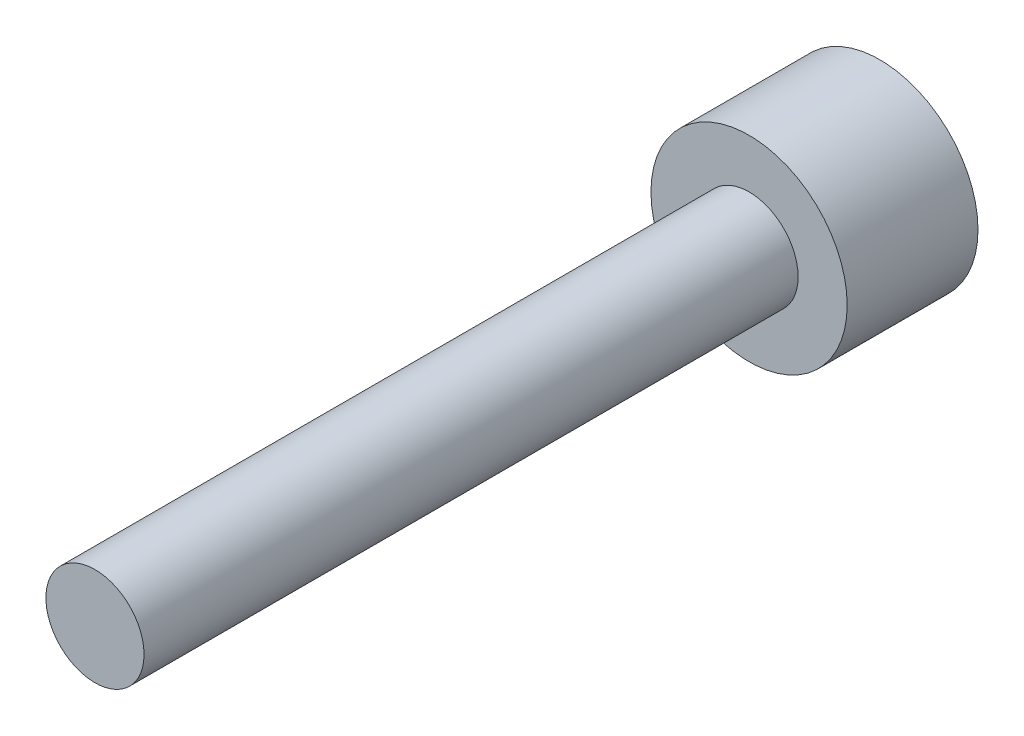
ISO-10303-21;
HEADER;
FILE_DESCRIPTION(('STEP AP214'),'2;1');
FILE_NAME('part.step','',(''),(''),'','','');
FILE_SCHEMA(('AUTOMOTIVE_DESIGN { 1 0 10303 214 1 1 1 1 }'));
ENDSEC;
DATA;
#1=APPLICATION_CONTEXT('core data for automotive mechanical design processes');
#2=APPLICATION_PROTOCOL_DEFINITION('international standard','automotive_design',2000,#1);
#3=PRODUCT_CONTEXT('',#1,'mechanical');
#4=PRODUCT('Part','Part','',(#3));
#5=PRODUCT_RELATED_PRODUCT_CATEGORY('part','',(#4));
#6=PRODUCT_DEFINITION_FORMATION('','',#4);
#7=PRODUCT_DEFINITION_CONTEXT('part definition',#1,'design');
#8=PRODUCT_DEFINITION('design','',#6,#7);
#9=PRODUCT_DEFINITION_SHAPE('','',#8);
#10=(LENGTH_UNIT() NAMED_UNIT(*) SI_UNIT(.MILLI.,.METRE.));
#11=(NAMED_UNIT(*) PLANE_ANGLE_UNIT() SI_UNIT($,.RADIAN.));
#12=(NAMED_UNIT(*) SI_UNIT($,.STERADIAN.) SOLID_ANGLE_UNIT());
#13=UNCERTAINTY_MEASURE_WITH_UNIT(LENGTH_MEASURE(1.E-05),#10,'distance_accuracy_value','');
#14=(GEOMETRIC_REPRESENTATION_CONTEXT(3) GLOBAL_UNCERTAINTY_ASSIGNED_CONTEXT((#13)) GLOBAL_UNIT_ASSIGNED_CONTEXT((#10,
#11,#12)) REPRESENTATION_CONTEXT('',''));
#15=CARTESIAN_POINT('',(0.,0.,0.));
#16=DIRECTION('',(0.,0.,1.));
#17=DIRECTION('',(1.,0.,0.));
#18=AXIS2_PLACEMENT_3D('',#15,#16,#17);
#19=CARTESIAN_POINT('',(0.,0.,4.));
#20=DIRECTION('',(0.,0.,1.));
#21=DIRECTION('',(1.,0.,0.));
#22=AXIS2_PLACEMENT_3D('',#19,#20,#21);
#23=PLANE('',#22);
#24=CARTESIAN_POINT('',(0.,0.,4.));
#25=DIRECTION('',(0.,0.,1.));
#26=DIRECTION('',(1.,0.,0.));
#27=AXIS2_PLACEMENT_3D('',#24,#25,#26);
#28=CIRCLE('',#27,3.);
#29=CARTESIAN_POINT('',(3.,0.,4.));
#30=VERTEX_POINT('',#29);
#31=EDGE_CURVE('E10',#30,#30,#28,.T.);
#32=ORIENTED_EDGE('',*,*,#31,.T.);
#33=EDGE_LOOP('',(#32));
#34=FACE_BOUND('',#33,.T.);
#35=CARTESIAN_POINT('',(0.,0.,4.));
#36=DIRECTION('',(0.,0.,1.));
#37=DIRECTION('',(1.,0.,0.));
#38=AXIS2_PLACEMENT_3D('',#35,#36,#37);
#39=CIRCLE('',#38,1.5);
#40=CARTESIAN_POINT('',(1.5,0.,4.));
#41=VERTEX_POINT('',#40);
#42=EDGE_CURVE('E45',#41,#41,#39,.T.);
#43=ORIENTED_EDGE('',*,*,#42,.F.);
#44=EDGE_LOOP('',(#43));
#45=FACE_BOUND('',#44,.T.);
#46=ADVANCED_FACE('F30',(#34,#45),#23,.T.);
#47=CARTESIAN_POINT('',(0.,0.,4.));
#48=DIRECTION('',(0.,0.,-1.));
#49=DIRECTION('',(-1.,0.,0.));
#50=AXIS2_PLACEMENT_3D('',#47,#48,#49);
#51=CYLINDRICAL_SURFACE('',#50,3.);
#52=ORIENTED_EDGE('',*,*,#31,.F.);
#53=EDGE_LOOP('',(#52));
#54=FACE_BOUND('',#53,.T.);
#55=CARTESIAN_POINT('',(0.,0.,0.));
#56=DIRECTION('',(0.,0.,1.));
#57=DIRECTION('',(1.,0.,0.));
#58=AXIS2_PLACEMENT_3D('',#55,#56,#57);
#59=CIRCLE('',#58,3.);
#60=CARTESIAN_POINT('',(3.,0.,0.));
#61=VERTEX_POINT('',#60);
#62=EDGE_CURVE('E37',#61,#61,#59,.T.);
#63=ORIENTED_EDGE('',*,*,#62,.T.);
#64=EDGE_LOOP('',(#63));
#65=FACE_BOUND('',#64,.T.);
#66=ADVANCED_FACE('F32',(#54,#65),#51,.T.);
#67=CARTESIAN_POINT('',(0.,0.,0.));
#68=DIRECTION('',(0.,0.,1.));
#69=DIRECTION('',(1.,0.,0.));
#70=AXIS2_PLACEMENT_3D('',#67,#68,#69);
#71=PLANE('',#70);
#72=ORIENTED_EDGE('',*,*,#62,.F.);
#73=EDGE_LOOP('',(#72));
#74=FACE_BOUND('',#73,.T.);
#75=ADVANCED_FACE('F57',(#74),#71,.F.);
#76=CARTESIAN_POINT('',(0.,0.,24.));
#77=DIRECTION('',(0.,0.,-1.));
#78=DIRECTION('',(-1.,0.,0.));
#79=AXIS2_PLACEMENT_3D('',#76,#77,#78);
#80=CYLINDRICAL_SURFACE('',#79,1.5);
#81=CARTESIAN_POINT('',(0.,0.,24.));
#82=DIRECTION('',(0.,0.,1.));
#83=DIRECTION('',(1.,0.,0.));
#84=AXIS2_PLACEMENT_3D('',#81,#82,#83);
#85=CIRCLE('',#84,1.5);
#86=CARTESIAN_POINT('',(1.5,0.,24.));
#87=VERTEX_POINT('',#86);
#88=EDGE_CURVE('E41',#87,#87,#85,.T.);
#89=ORIENTED_EDGE('',*,*,#88,.F.);
#90=EDGE_LOOP('',(#89));
#91=FACE_BOUND('',#90,.T.);
#92=ORIENTED_EDGE('',*,*,#42,.T.);
#93=EDGE_LOOP('',(#92));
#94=FACE_BOUND('',#93,.T.);
#95=ADVANCED_FACE('F51',(#91,#94),#80,.T.);
#96=CARTESIAN_POINT('',(0.,0.,24.));
#97=DIRECTION('',(0.,0.,1.));
#98=DIRECTION('',(1.,0.,0.));
#99=AXIS2_PLACEMENT_3D('',#96,#97,#98);
#100=PLANE('',#99);
#101=ORIENTED_EDGE('',*,*,#88,.T.);
#102=EDGE_LOOP('',(#101));
#103=FACE_BOUND('',#102,.T.);
#104=ADVANCED_FACE('F65',(#103),#100,.T.);
#105=CLOSED_SHELL('',(#46,#66,#75,#95,#104));
#106=MANIFOLD_SOLID_BREP('B2',#105);
#107=ADVANCED_BREP_SHAPE_REPRESENTATION('',(#18,#106),#14);
#108=SHAPE_DEFINITION_REPRESENTATION(#9,#107);
ENDSEC;
END-ISO-10303-21;
